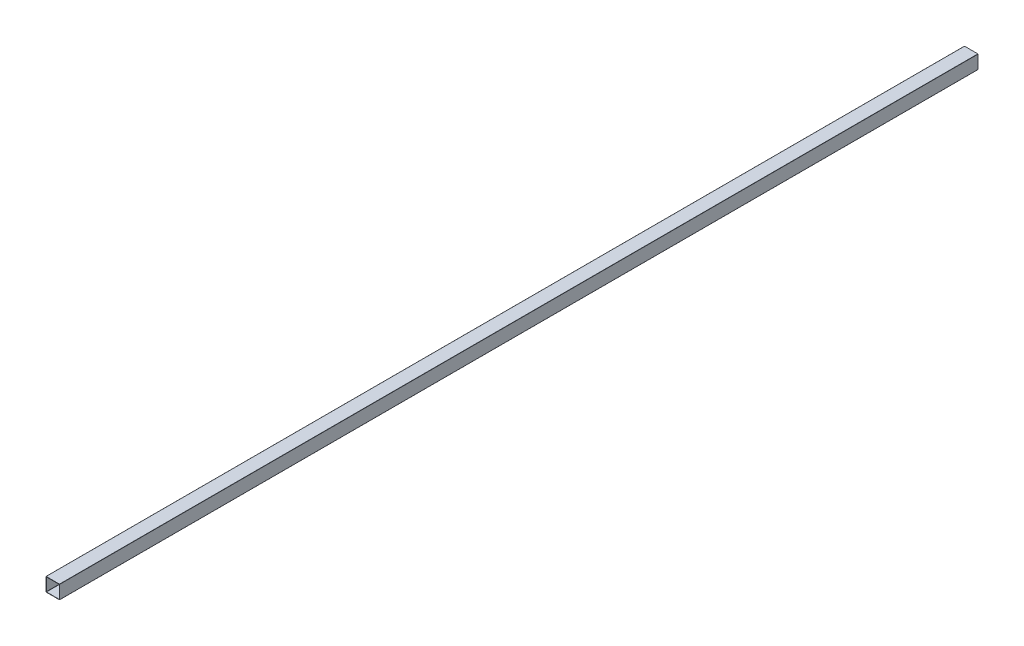
ISO-10303-21;
HEADER;
FILE_DESCRIPTION(('STEP AP214'),'2;1');
FILE_NAME('part.step','',(''),(''),'','','');
FILE_SCHEMA(('AUTOMOTIVE_DESIGN { 1 0 10303 214 1 1 1 1 }'));
ENDSEC;
DATA;
#1=APPLICATION_CONTEXT('core data for automotive mechanical design processes');
#2=APPLICATION_PROTOCOL_DEFINITION('international standard','automotive_design',2000,#1);
#3=PRODUCT_CONTEXT('',#1,'mechanical');
#4=PRODUCT('Part','Part','',(#3));
#5=PRODUCT_RELATED_PRODUCT_CATEGORY('part','',(#4));
#6=PRODUCT_DEFINITION_FORMATION('','',#4);
#7=PRODUCT_DEFINITION_CONTEXT('part definition',#1,'design');
#8=PRODUCT_DEFINITION('design','',#6,#7);
#9=PRODUCT_DEFINITION_SHAPE('','',#8);
#10=(LENGTH_UNIT() NAMED_UNIT(*) SI_UNIT(.MILLI.,.METRE.));
#11=(NAMED_UNIT(*) PLANE_ANGLE_UNIT() SI_UNIT($,.RADIAN.));
#12=(NAMED_UNIT(*) SI_UNIT($,.STERADIAN.) SOLID_ANGLE_UNIT());
#13=UNCERTAINTY_MEASURE_WITH_UNIT(LENGTH_MEASURE(1.E-05),#10,'distance_accuracy_value','');
#14=(GEOMETRIC_REPRESENTATION_CONTEXT(3) GLOBAL_UNCERTAINTY_ASSIGNED_CONTEXT((#13)) GLOBAL_UNIT_ASSIGNED_CONTEXT((#10,
#11,#12)) REPRESENTATION_CONTEXT('',''));
#15=CARTESIAN_POINT('',(0.,0.,0.));
#16=DIRECTION('',(0.,0.,1.));
#17=DIRECTION('',(1.,0.,0.));
#18=AXIS2_PLACEMENT_3D('',#15,#16,#17);
#19=CARTESIAN_POINT('',(44.45,-44.45,-6000.));
#20=DIRECTION('',(1.,0.,0.));
#21=DIRECTION('',(0.,0.,-1.));
#22=AXIS2_PLACEMENT_3D('',#19,#20,#21);
#23=PLANE('',#22);
#24=DIRECTION('',(0.,1.,0.));
#25=VECTOR('',#24,1.);
#26=CARTESIAN_POINT('',(44.45,-44.45,0.));
#27=LINE('',#26,#25);
#28=CARTESIAN_POINT('',(44.45,-43.45,0.));
#29=VERTEX_POINT('',#28);
#30=CARTESIAN_POINT('',(44.45,43.45,0.));
#31=VERTEX_POINT('',#30);
#32=EDGE_CURVE('E197',#29,#31,#27,.T.);
#33=ORIENTED_EDGE('',*,*,#32,.F.);
#34=DIRECTION('',(0.,0.,1.));
#35=VECTOR('',#34,1.);
#36=CARTESIAN_POINT('',(44.45,-43.45,-6000.));
#37=LINE('',#36,#35);
#38=CARTESIAN_POINT('',(44.45,-43.45,-6000.));
#39=VERTEX_POINT('',#38);
#40=EDGE_CURVE('E158',#29,#39,#37,.F.);
#41=ORIENTED_EDGE('',*,*,#40,.T.);
#42=DIRECTION('',(0.,1.,0.));
#43=VECTOR('',#42,1.);
#44=CARTESIAN_POINT('',(44.45,-44.45,-6000.));
#45=LINE('',#44,#43);
#46=CARTESIAN_POINT('',(44.45,43.45,-6000.));
#47=VERTEX_POINT('',#46);
#48=EDGE_CURVE('E185',#39,#47,#45,.T.);
#49=ORIENTED_EDGE('',*,*,#48,.T.);
#50=DIRECTION('',(0.,0.,1.));
#51=VECTOR('',#50,1.);
#52=CARTESIAN_POINT('',(44.45,43.45,-6000.));
#53=LINE('',#52,#51);
#54=EDGE_CURVE('E251',#47,#31,#53,.T.);
#55=ORIENTED_EDGE('',*,*,#54,.T.);
#56=EDGE_LOOP('',(#33,#41,#49,#55));
#57=FACE_BOUND('',#56,.T.);
#58=ADVANCED_FACE('F33',(#57),#23,.T.);
#59=CARTESIAN_POINT('',(-44.45,-44.45,-6000.));
#60=DIRECTION('',(0.,-1.,0.));
#61=DIRECTION('',(0.,0.,-1.));
#62=AXIS2_PLACEMENT_3D('',#59,#60,#61);
#63=PLANE('',#62);
#64=DIRECTION('',(1.,0.,0.));
#65=VECTOR('',#64,1.);
#66=CARTESIAN_POINT('',(-44.45,-44.45,0.));
#67=LINE('',#66,#65);
#68=CARTESIAN_POINT('',(-43.45,-44.45,0.));
#69=VERTEX_POINT('',#68);
#70=CARTESIAN_POINT('',(43.45,-44.45,0.));
#71=VERTEX_POINT('',#70);
#72=EDGE_CURVE('E189',#69,#71,#67,.T.);
#73=ORIENTED_EDGE('',*,*,#72,.F.);
#74=DIRECTION('',(0.,0.,1.));
#75=VECTOR('',#74,1.);
#76=CARTESIAN_POINT('',(-43.45,-44.45,-6000.));
#77=LINE('',#76,#75);
#78=CARTESIAN_POINT('',(-43.45,-44.45,-6000.));
#79=VERTEX_POINT('',#78);
#80=EDGE_CURVE('E238',#69,#79,#77,.F.);
#81=ORIENTED_EDGE('',*,*,#80,.T.);
#82=DIRECTION('',(1.,0.,0.));
#83=VECTOR('',#82,1.);
#84=CARTESIAN_POINT('',(-44.45,-44.45,-6000.));
#85=LINE('',#84,#83);
#86=CARTESIAN_POINT('',(43.45,-44.45,-6000.));
#87=VERTEX_POINT('',#86);
#88=EDGE_CURVE('E194',#79,#87,#85,.T.);
#89=ORIENTED_EDGE('',*,*,#88,.T.);
#90=DIRECTION('',(0.,0.,1.));
#91=VECTOR('',#90,1.);
#92=CARTESIAN_POINT('',(43.45,-44.45,-6000.));
#93=LINE('',#92,#91);
#94=EDGE_CURVE('E235',#87,#71,#93,.T.);
#95=ORIENTED_EDGE('',*,*,#94,.T.);
#96=EDGE_LOOP('',(#73,#81,#89,#95));
#97=FACE_BOUND('',#96,.T.);
#98=ADVANCED_FACE('F305',(#97),#63,.T.);
#99=CARTESIAN_POINT('',(-44.45,-44.45,-6000.));
#100=DIRECTION('',(-1.,0.,0.));
#101=DIRECTION('',(0.,0.,1.));
#102=AXIS2_PLACEMENT_3D('',#99,#100,#101);
#103=PLANE('',#102);
#104=DIRECTION('',(0.,-1.,0.));
#105=VECTOR('',#104,1.);
#106=CARTESIAN_POINT('',(-44.45,-44.45,-6000.));
#107=LINE('',#106,#105);
#108=CARTESIAN_POINT('',(-44.45,43.45,-6000.));
#109=VERTEX_POINT('',#108);
#110=CARTESIAN_POINT('',(-44.45,-43.45,-6000.));
#111=VERTEX_POINT('',#110);
#112=EDGE_CURVE('E191',#109,#111,#107,.T.);
#113=ORIENTED_EDGE('',*,*,#112,.T.);
#114=DIRECTION('',(0.,0.,1.));
#115=VECTOR('',#114,1.);
#116=CARTESIAN_POINT('',(-44.45,-43.45,-6000.));
#117=LINE('',#116,#115);
#118=CARTESIAN_POINT('',(-44.45,-43.45,0.));
#119=VERTEX_POINT('',#118);
#120=EDGE_CURVE('E224',#111,#119,#117,.T.);
#121=ORIENTED_EDGE('',*,*,#120,.T.);
#122=DIRECTION('',(0.,-1.,0.));
#123=VECTOR('',#122,1.);
#124=CARTESIAN_POINT('',(-44.45,-44.45,0.));
#125=LINE('',#124,#123);
#126=CARTESIAN_POINT('',(-44.45,43.45,0.));
#127=VERTEX_POINT('',#126);
#128=EDGE_CURVE('E203',#127,#119,#125,.T.);
#129=ORIENTED_EDGE('',*,*,#128,.F.);
#130=DIRECTION('',(0.,0.,1.));
#131=VECTOR('',#130,1.);
#132=CARTESIAN_POINT('',(-44.45,43.45,-6000.));
#133=LINE('',#132,#131);
#134=EDGE_CURVE('E222',#127,#109,#133,.F.);
#135=ORIENTED_EDGE('',*,*,#134,.T.);
#136=EDGE_LOOP('',(#113,#121,#129,#135));
#137=FACE_BOUND('',#136,.T.);
#138=ADVANCED_FACE('F311',(#137),#103,.T.);
#139=CARTESIAN_POINT('',(-44.45,44.45,-6000.));
#140=DIRECTION('',(0.,1.,0.));
#141=DIRECTION('',(0.,0.,1.));
#142=AXIS2_PLACEMENT_3D('',#139,#140,#141);
#143=PLANE('',#142);
#144=DIRECTION('',(-1.,0.,0.));
#145=VECTOR('',#144,1.);
#146=CARTESIAN_POINT('',(-44.45,44.45,-6000.));
#147=LINE('',#146,#145);
#148=CARTESIAN_POINT('',(43.45,44.45,-6000.));
#149=VERTEX_POINT('',#148);
#150=CARTESIAN_POINT('',(-43.45,44.45,-6000.));
#151=VERTEX_POINT('',#150);
#152=EDGE_CURVE('E188',#149,#151,#147,.T.);
#153=ORIENTED_EDGE('',*,*,#152,.T.);
#154=DIRECTION('',(0.,0.,1.));
#155=VECTOR('',#154,1.);
#156=CARTESIAN_POINT('',(-43.45,44.45,-6000.));
#157=LINE('',#156,#155);
#158=CARTESIAN_POINT('',(-43.45,44.45,0.));
#159=VERTEX_POINT('',#158);
#160=EDGE_CURVE('E248',#151,#159,#157,.T.);
#161=ORIENTED_EDGE('',*,*,#160,.T.);
#162=DIRECTION('',(-1.,0.,0.));
#163=VECTOR('',#162,1.);
#164=CARTESIAN_POINT('',(-44.45,44.45,0.));
#165=LINE('',#164,#163);
#166=CARTESIAN_POINT('',(43.45,44.45,0.));
#167=VERTEX_POINT('',#166);
#168=EDGE_CURVE('E200',#167,#159,#165,.T.);
#169=ORIENTED_EDGE('',*,*,#168,.F.);
#170=DIRECTION('',(0.,0.,1.));
#171=VECTOR('',#170,1.);
#172=CARTESIAN_POINT('',(43.45,44.45,-6000.));
#173=LINE('',#172,#171);
#174=EDGE_CURVE('E55',#167,#149,#173,.F.);
#175=ORIENTED_EDGE('',*,*,#174,.T.);
#176=EDGE_LOOP('',(#153,#161,#169,#175));
#177=FACE_BOUND('',#176,.T.);
#178=ADVANCED_FACE('F316',(#177),#143,.T.);
#179=CARTESIAN_POINT('',(0.,0.,-6000.));
#180=DIRECTION('',(0.,0.,-1.));
#181=DIRECTION('',(-1.,0.,0.));
#182=AXIS2_PLACEMENT_3D('',#179,#180,#181);
#183=PLANE('',#182);
#184=DIRECTION('',(0.,-1.,0.));
#185=VECTOR('',#184,1.);
#186=CARTESIAN_POINT('',(-42.56,-42.56,-6000.));
#187=LINE('',#186,#185);
#188=CARTESIAN_POINT('',(-42.56,41.56,-6000.));
#189=VERTEX_POINT('',#188);
#190=CARTESIAN_POINT('',(-42.56,-41.56,-6000.));
#191=VERTEX_POINT('',#190);
#192=EDGE_CURVE('E167',#189,#191,#187,.T.);
#193=ORIENTED_EDGE('',*,*,#192,.T.);
#194=CARTESIAN_POINT('',(-41.56,-41.56,-6000.));
#195=DIRECTION('',(0.,0.,-1.));
#196=DIRECTION('',(-1.,0.,0.));
#197=AXIS2_PLACEMENT_3D('',#194,#195,#196);
#198=CIRCLE('',#197,1.);
#199=CARTESIAN_POINT('',(-41.56,-42.56,-6000.));
#200=VERTEX_POINT('',#199);
#201=EDGE_CURVE('E11',#191,#200,#198,.F.);
#202=ORIENTED_EDGE('',*,*,#201,.T.);
#203=DIRECTION('',(1.,0.,0.));
#204=VECTOR('',#203,1.);
#205=CARTESIAN_POINT('',(-42.56,-42.56,-6000.));
#206=LINE('',#205,#204);
#207=CARTESIAN_POINT('',(41.56,-42.56,-6000.));
#208=VERTEX_POINT('',#207);
#209=EDGE_CURVE('E175',#200,#208,#206,.T.);
#210=ORIENTED_EDGE('',*,*,#209,.T.);
#211=CARTESIAN_POINT('',(41.56,-41.56,-6000.));
#212=DIRECTION('',(0.,0.,-1.));
#213=DIRECTION('',(-1.,0.,0.));
#214=AXIS2_PLACEMENT_3D('',#211,#212,#213);
#215=CIRCLE('',#214,1.);
#216=CARTESIAN_POINT('',(42.56,-41.56,-6000.));
#217=VERTEX_POINT('',#216);
#218=EDGE_CURVE('E262',#208,#217,#215,.F.);
#219=ORIENTED_EDGE('',*,*,#218,.T.);
#220=DIRECTION('',(0.,1.,0.));
#221=VECTOR('',#220,1.);
#222=CARTESIAN_POINT('',(42.56,-42.56,-6000.));
#223=LINE('',#222,#221);
#224=CARTESIAN_POINT('',(42.56,41.56,-6000.));
#225=VERTEX_POINT('',#224);
#226=EDGE_CURVE('E179',#217,#225,#223,.T.);
#227=ORIENTED_EDGE('',*,*,#226,.T.);
#228=CARTESIAN_POINT('',(41.56,41.56,-6000.));
#229=DIRECTION('',(0.,0.,-1.));
#230=DIRECTION('',(-1.,0.,0.));
#231=AXIS2_PLACEMENT_3D('',#228,#229,#230);
#232=CIRCLE('',#231,1.);
#233=CARTESIAN_POINT('',(41.56,42.56,-6000.));
#234=VERTEX_POINT('',#233);
#235=EDGE_CURVE('E258',#225,#234,#232,.F.);
#236=ORIENTED_EDGE('',*,*,#235,.T.);
#237=DIRECTION('',(-1.,0.,0.));
#238=VECTOR('',#237,1.);
#239=CARTESIAN_POINT('',(-42.56,42.56,-6000.));
#240=LINE('',#239,#238);
#241=CARTESIAN_POINT('',(-41.56,42.56,-6000.));
#242=VERTEX_POINT('',#241);
#243=EDGE_CURVE('E277',#234,#242,#240,.T.);
#244=ORIENTED_EDGE('',*,*,#243,.T.);
#245=CARTESIAN_POINT('',(-41.56,41.56,-6000.));
#246=DIRECTION('',(0.,0.,-1.));
#247=DIRECTION('',(-1.,0.,0.));
#248=AXIS2_PLACEMENT_3D('',#245,#246,#247);
#249=CIRCLE('',#248,1.);
#250=EDGE_CURVE('E157',#242,#189,#249,.F.);
#251=ORIENTED_EDGE('',*,*,#250,.T.);
#252=EDGE_LOOP('',(#193,#202,#210,#219,#227,#236,#244,#251));
#253=FACE_BOUND('',#252,.T.);
#254=ORIENTED_EDGE('',*,*,#88,.F.);
#255=CARTESIAN_POINT('',(-43.45,-43.45,-6000.));
#256=DIRECTION('',(0.,0.,-1.));
#257=DIRECTION('',(-1.,0.,0.));
#258=AXIS2_PLACEMENT_3D('',#255,#256,#257);
#259=CIRCLE('',#258,1.);
#260=EDGE_CURVE('E245',#79,#111,#259,.T.);
#261=ORIENTED_EDGE('',*,*,#260,.T.);
#262=ORIENTED_EDGE('',*,*,#112,.F.);
#263=CARTESIAN_POINT('',(-43.45,43.45,-6000.));
#264=DIRECTION('',(0.,0.,-1.));
#265=DIRECTION('',(-1.,0.,0.));
#266=AXIS2_PLACEMENT_3D('',#263,#264,#265);
#267=CIRCLE('',#266,1.);
#268=EDGE_CURVE('E48',#109,#151,#267,.T.);
#269=ORIENTED_EDGE('',*,*,#268,.T.);
#270=ORIENTED_EDGE('',*,*,#152,.F.);
#271=CARTESIAN_POINT('',(43.45,43.45,-6000.));
#272=DIRECTION('',(0.,0.,-1.));
#273=DIRECTION('',(-1.,0.,0.));
#274=AXIS2_PLACEMENT_3D('',#271,#272,#273);
#275=CIRCLE('',#274,1.);
#276=EDGE_CURVE('E240',#149,#47,#275,.T.);
#277=ORIENTED_EDGE('',*,*,#276,.T.);
#278=ORIENTED_EDGE('',*,*,#48,.F.);
#279=CARTESIAN_POINT('',(43.45,-43.45,-6000.));
#280=DIRECTION('',(0.,0.,-1.));
#281=DIRECTION('',(-1.,0.,0.));
#282=AXIS2_PLACEMENT_3D('',#279,#280,#281);
#283=CIRCLE('',#282,1.);
#284=EDGE_CURVE('E242',#39,#87,#283,.T.);
#285=ORIENTED_EDGE('',*,*,#284,.T.);
#286=EDGE_LOOP('',(#254,#261,#262,#269,#270,#277,#278,#285));
#287=FACE_BOUND('',#286,.T.);
#288=ADVANCED_FACE('F267',(#253,#287),#183,.T.);
#289=CARTESIAN_POINT('',(0.,0.,0.));
#290=DIRECTION('',(0.,0.,-1.));
#291=DIRECTION('',(-1.,0.,0.));
#292=AXIS2_PLACEMENT_3D('',#289,#290,#291);
#293=PLANE('',#292);
#294=DIRECTION('',(0.,1.,0.));
#295=VECTOR('',#294,1.);
#296=CARTESIAN_POINT('',(42.56,-42.56,0.));
#297=LINE('',#296,#295);
#298=CARTESIAN_POINT('',(42.56,-41.56,0.));
#299=VERTEX_POINT('',#298);
#300=CARTESIAN_POINT('',(42.56,41.56,0.));
#301=VERTEX_POINT('',#300);
#302=EDGE_CURVE('E181',#299,#301,#297,.T.);
#303=ORIENTED_EDGE('',*,*,#302,.F.);
#304=CARTESIAN_POINT('',(41.56,-41.56,0.));
#305=DIRECTION('',(0.,0.,-1.));
#306=DIRECTION('',(-1.,0.,0.));
#307=AXIS2_PLACEMENT_3D('',#304,#305,#306);
#308=CIRCLE('',#307,1.);
#309=CARTESIAN_POINT('',(41.56,-42.56,0.));
#310=VERTEX_POINT('',#309);
#311=EDGE_CURVE('E260',#299,#310,#308,.T.);
#312=ORIENTED_EDGE('',*,*,#311,.T.);
#313=DIRECTION('',(1.,0.,0.));
#314=VECTOR('',#313,1.);
#315=CARTESIAN_POINT('',(-42.56,-42.56,0.));
#316=LINE('',#315,#314);
#317=CARTESIAN_POINT('',(-41.56,-42.56,0.));
#318=VERTEX_POINT('',#317);
#319=EDGE_CURVE('E281',#318,#310,#316,.T.);
#320=ORIENTED_EDGE('',*,*,#319,.F.);
#321=CARTESIAN_POINT('',(-41.56,-41.56,0.));
#322=DIRECTION('',(0.,0.,-1.));
#323=DIRECTION('',(-1.,0.,0.));
#324=AXIS2_PLACEMENT_3D('',#321,#322,#323);
#325=CIRCLE('',#324,1.);
#326=CARTESIAN_POINT('',(-42.56,-41.56,0.));
#327=VERTEX_POINT('',#326);
#328=EDGE_CURVE('E41',#318,#327,#325,.T.);
#329=ORIENTED_EDGE('',*,*,#328,.T.);
#330=DIRECTION('',(0.,-1.,0.));
#331=VECTOR('',#330,1.);
#332=CARTESIAN_POINT('',(-42.56,-42.56,0.));
#333=LINE('',#332,#331);
#334=CARTESIAN_POINT('',(-42.56,41.56,0.));
#335=VERTEX_POINT('',#334);
#336=EDGE_CURVE('E164',#335,#327,#333,.T.);
#337=ORIENTED_EDGE('',*,*,#336,.F.);
#338=CARTESIAN_POINT('',(-41.56,41.56,0.));
#339=DIRECTION('',(0.,0.,-1.));
#340=DIRECTION('',(-1.,0.,0.));
#341=AXIS2_PLACEMENT_3D('',#338,#339,#340);
#342=CIRCLE('',#341,1.);
#343=CARTESIAN_POINT('',(-41.56,42.56,0.));
#344=VERTEX_POINT('',#343);
#345=EDGE_CURVE('E147',#335,#344,#342,.T.);
#346=ORIENTED_EDGE('',*,*,#345,.T.);
#347=DIRECTION('',(-1.,0.,0.));
#348=VECTOR('',#347,1.);
#349=CARTESIAN_POINT('',(-42.56,42.56,0.));
#350=LINE('',#349,#348);
#351=CARTESIAN_POINT('',(41.56,42.56,0.));
#352=VERTEX_POINT('',#351);
#353=EDGE_CURVE('E176',#352,#344,#350,.T.);
#354=ORIENTED_EDGE('',*,*,#353,.F.);
#355=CARTESIAN_POINT('',(41.56,41.56,0.));
#356=DIRECTION('',(0.,0.,-1.));
#357=DIRECTION('',(-1.,0.,0.));
#358=AXIS2_PLACEMENT_3D('',#355,#356,#357);
#359=CIRCLE('',#358,1.);
#360=EDGE_CURVE('E256',#352,#301,#359,.T.);
#361=ORIENTED_EDGE('',*,*,#360,.T.);
#362=EDGE_LOOP('',(#303,#312,#320,#329,#337,#346,#354,#361));
#363=FACE_BOUND('',#362,.T.);
#364=ORIENTED_EDGE('',*,*,#128,.T.);
#365=CARTESIAN_POINT('',(-43.45,-43.45,0.));
#366=DIRECTION('',(0.,0.,-1.));
#367=DIRECTION('',(-1.,0.,0.));
#368=AXIS2_PLACEMENT_3D('',#365,#366,#367);
#369=CIRCLE('',#368,1.);
#370=EDGE_CURVE('E233',#119,#69,#369,.F.);
#371=ORIENTED_EDGE('',*,*,#370,.T.);
#372=ORIENTED_EDGE('',*,*,#72,.T.);
#373=CARTESIAN_POINT('',(43.45,-43.45,0.));
#374=DIRECTION('',(0.,0.,-1.));
#375=DIRECTION('',(-1.,0.,0.));
#376=AXIS2_PLACEMENT_3D('',#373,#374,#375);
#377=CIRCLE('',#376,1.);
#378=EDGE_CURVE('E229',#71,#29,#377,.F.);
#379=ORIENTED_EDGE('',*,*,#378,.T.);
#380=ORIENTED_EDGE('',*,*,#32,.T.);
#381=CARTESIAN_POINT('',(43.45,43.45,0.));
#382=DIRECTION('',(0.,0.,-1.));
#383=DIRECTION('',(-1.,0.,0.));
#384=AXIS2_PLACEMENT_3D('',#381,#382,#383);
#385=CIRCLE('',#384,1.);
#386=EDGE_CURVE('E227',#31,#167,#385,.F.);
#387=ORIENTED_EDGE('',*,*,#386,.T.);
#388=ORIENTED_EDGE('',*,*,#168,.T.);
#389=CARTESIAN_POINT('',(-43.45,43.45,0.));
#390=DIRECTION('',(0.,0.,-1.));
#391=DIRECTION('',(-1.,0.,0.));
#392=AXIS2_PLACEMENT_3D('',#389,#390,#391);
#393=CIRCLE('',#392,1.);
#394=EDGE_CURVE('E231',#159,#127,#393,.F.);
#395=ORIENTED_EDGE('',*,*,#394,.T.);
#396=EDGE_LOOP('',(#364,#371,#372,#379,#380,#387,#388,#395));
#397=FACE_BOUND('',#396,.T.);
#398=ADVANCED_FACE('F172',(#363,#397),#293,.F.);
#399=CARTESIAN_POINT('',(-42.56,-42.56,-6000.));
#400=DIRECTION('',(0.,-1.,0.));
#401=DIRECTION('',(0.,0.,-1.));
#402=AXIS2_PLACEMENT_3D('',#399,#400,#401);
#403=PLANE('',#402);
#404=ORIENTED_EDGE('',*,*,#319,.T.);
#405=DIRECTION('',(0.,0.,1.));
#406=VECTOR('',#405,1.);
#407=CARTESIAN_POINT('',(41.56,-42.56,-6000.));
#408=LINE('',#407,#406);
#409=EDGE_CURVE('E220',#310,#208,#408,.F.);
#410=ORIENTED_EDGE('',*,*,#409,.T.);
#411=ORIENTED_EDGE('',*,*,#209,.F.);
#412=DIRECTION('',(0.,0.,1.));
#413=VECTOR('',#412,1.);
#414=CARTESIAN_POINT('',(-41.56,-42.56,0.));
#415=LINE('',#414,#413);
#416=EDGE_CURVE('E217',#200,#318,#415,.T.);
#417=ORIENTED_EDGE('',*,*,#416,.T.);
#418=EDGE_LOOP('',(#404,#410,#411,#417));
#419=FACE_BOUND('',#418,.T.);
#420=ADVANCED_FACE('F283',(#419),#403,.F.);
#421=CARTESIAN_POINT('',(-42.56,-42.56,-6000.));
#422=DIRECTION('',(-1.,0.,0.));
#423=DIRECTION('',(0.,0.,1.));
#424=AXIS2_PLACEMENT_3D('',#421,#422,#423);
#425=PLANE('',#424);
#426=ORIENTED_EDGE('',*,*,#192,.F.);
#427=DIRECTION('',(0.,0.,1.));
#428=VECTOR('',#427,1.);
#429=CARTESIAN_POINT('',(-42.56,41.56,0.));
#430=LINE('',#429,#428);
#431=EDGE_CURVE('E151',#189,#335,#430,.T.);
#432=ORIENTED_EDGE('',*,*,#431,.T.);
#433=ORIENTED_EDGE('',*,*,#336,.T.);
#434=DIRECTION('',(0.,0.,1.));
#435=VECTOR('',#434,1.);
#436=CARTESIAN_POINT('',(-42.56,-41.56,-6000.));
#437=LINE('',#436,#435);
#438=EDGE_CURVE('E169',#327,#191,#437,.F.);
#439=ORIENTED_EDGE('',*,*,#438,.T.);
#440=EDGE_LOOP('',(#426,#432,#433,#439));
#441=FACE_BOUND('',#440,.T.);
#442=ADVANCED_FACE('F163',(#441),#425,.F.);
#443=CARTESIAN_POINT('',(-42.56,42.56,-6000.));
#444=DIRECTION('',(0.,1.,0.));
#445=DIRECTION('',(0.,0.,1.));
#446=AXIS2_PLACEMENT_3D('',#443,#444,#445);
#447=PLANE('',#446);
#448=ORIENTED_EDGE('',*,*,#353,.T.);
#449=DIRECTION('',(0.,0.,1.));
#450=VECTOR('',#449,1.);
#451=CARTESIAN_POINT('',(-41.56,42.56,-6000.));
#452=LINE('',#451,#450);
#453=EDGE_CURVE('E152',#344,#242,#452,.F.);
#454=ORIENTED_EDGE('',*,*,#453,.T.);
#455=ORIENTED_EDGE('',*,*,#243,.F.);
#456=DIRECTION('',(0.,0.,1.));
#457=VECTOR('',#456,1.);
#458=CARTESIAN_POINT('',(41.56,42.56,0.));
#459=LINE('',#458,#457);
#460=EDGE_CURVE('E168',#234,#352,#459,.T.);
#461=ORIENTED_EDGE('',*,*,#460,.T.);
#462=EDGE_LOOP('',(#448,#454,#455,#461));
#463=FACE_BOUND('',#462,.T.);
#464=ADVANCED_FACE('F292',(#463),#447,.F.);
#465=CARTESIAN_POINT('',(42.56,-42.56,-6000.));
#466=DIRECTION('',(1.,0.,0.));
#467=DIRECTION('',(0.,0.,-1.));
#468=AXIS2_PLACEMENT_3D('',#465,#466,#467);
#469=PLANE('',#468);
#470=ORIENTED_EDGE('',*,*,#302,.T.);
#471=DIRECTION('',(0.,0.,1.));
#472=VECTOR('',#471,1.);
#473=CARTESIAN_POINT('',(42.56,41.56,-6000.));
#474=LINE('',#473,#472);
#475=EDGE_CURVE('E215',#301,#225,#474,.F.);
#476=ORIENTED_EDGE('',*,*,#475,.T.);
#477=ORIENTED_EDGE('',*,*,#226,.F.);
#478=DIRECTION('',(0.,0.,1.));
#479=VECTOR('',#478,1.);
#480=CARTESIAN_POINT('',(42.56,-41.56,0.));
#481=LINE('',#480,#479);
#482=EDGE_CURVE('E212',#217,#299,#481,.T.);
#483=ORIENTED_EDGE('',*,*,#482,.T.);
#484=EDGE_LOOP('',(#470,#476,#477,#483));
#485=FACE_BOUND('',#484,.T.);
#486=ADVANCED_FACE('F275',(#485),#469,.F.);
#487=CARTESIAN_POINT('',(-41.56,41.56,-6000.));
#488=DIRECTION('',(0.,0.,-1.));
#489=DIRECTION('',(-1.,0.,0.));
#490=AXIS2_PLACEMENT_3D('',#487,#488,#489);
#491=CYLINDRICAL_SURFACE('',#490,1.);
#492=ORIENTED_EDGE('',*,*,#250,.F.);
#493=ORIENTED_EDGE('',*,*,#453,.F.);
#494=ORIENTED_EDGE('',*,*,#345,.F.);
#495=ORIENTED_EDGE('',*,*,#431,.F.);
#496=EDGE_LOOP('',(#492,#493,#494,#495));
#497=FACE_BOUND('',#496,.T.);
#498=ADVANCED_FACE('F150',(#497),#491,.F.);
#499=CARTESIAN_POINT('',(41.56,41.56,-6000.));
#500=DIRECTION('',(0.,0.,-1.));
#501=DIRECTION('',(-1.,0.,0.));
#502=AXIS2_PLACEMENT_3D('',#499,#500,#501);
#503=CYLINDRICAL_SURFACE('',#502,1.);
#504=ORIENTED_EDGE('',*,*,#235,.F.);
#505=ORIENTED_EDGE('',*,*,#475,.F.);
#506=ORIENTED_EDGE('',*,*,#360,.F.);
#507=ORIENTED_EDGE('',*,*,#460,.F.);
#508=EDGE_LOOP('',(#504,#505,#506,#507));
#509=FACE_BOUND('',#508,.T.);
#510=ADVANCED_FACE('F294',(#509),#503,.F.);
#511=CARTESIAN_POINT('',(41.56,-41.56,-6000.));
#512=DIRECTION('',(0.,0.,-1.));
#513=DIRECTION('',(-1.,0.,0.));
#514=AXIS2_PLACEMENT_3D('',#511,#512,#513);
#515=CYLINDRICAL_SURFACE('',#514,1.);
#516=ORIENTED_EDGE('',*,*,#218,.F.);
#517=ORIENTED_EDGE('',*,*,#409,.F.);
#518=ORIENTED_EDGE('',*,*,#311,.F.);
#519=ORIENTED_EDGE('',*,*,#482,.F.);
#520=EDGE_LOOP('',(#516,#517,#518,#519));
#521=FACE_BOUND('',#520,.T.);
#522=ADVANCED_FACE('F279',(#521),#515,.F.);
#523=CARTESIAN_POINT('',(-43.45,-43.45,-6000.));
#524=DIRECTION('',(0.,0.,1.));
#525=DIRECTION('',(1.,0.,0.));
#526=AXIS2_PLACEMENT_3D('',#523,#524,#525);
#527=CYLINDRICAL_SURFACE('',#526,1.);
#528=ORIENTED_EDGE('',*,*,#260,.F.);
#529=ORIENTED_EDGE('',*,*,#80,.F.);
#530=ORIENTED_EDGE('',*,*,#370,.F.);
#531=ORIENTED_EDGE('',*,*,#120,.F.);
#532=EDGE_LOOP('',(#528,#529,#530,#531));
#533=FACE_BOUND('',#532,.T.);
#534=ADVANCED_FACE('F301',(#533),#527,.T.);
#535=CARTESIAN_POINT('',(-43.45,43.45,-6000.));
#536=DIRECTION('',(0.,0.,1.));
#537=DIRECTION('',(1.,0.,0.));
#538=AXIS2_PLACEMENT_3D('',#535,#536,#537);
#539=CYLINDRICAL_SURFACE('',#538,1.);
#540=ORIENTED_EDGE('',*,*,#268,.F.);
#541=ORIENTED_EDGE('',*,*,#134,.F.);
#542=ORIENTED_EDGE('',*,*,#394,.F.);
#543=ORIENTED_EDGE('',*,*,#160,.F.);
#544=EDGE_LOOP('',(#540,#541,#542,#543));
#545=FACE_BOUND('',#544,.T.);
#546=ADVANCED_FACE('F368',(#545),#539,.T.);
#547=CARTESIAN_POINT('',(-41.56,-41.56,-6000.));
#548=DIRECTION('',(0.,0.,-1.));
#549=DIRECTION('',(-1.,0.,0.));
#550=AXIS2_PLACEMENT_3D('',#547,#548,#549);
#551=CYLINDRICAL_SURFACE('',#550,1.);
#552=ORIENTED_EDGE('',*,*,#201,.F.);
#553=ORIENTED_EDGE('',*,*,#438,.F.);
#554=ORIENTED_EDGE('',*,*,#328,.F.);
#555=ORIENTED_EDGE('',*,*,#416,.F.);
#556=EDGE_LOOP('',(#552,#553,#554,#555));
#557=FACE_BOUND('',#556,.T.);
#558=ADVANCED_FACE('F378',(#557),#551,.F.);
#559=CARTESIAN_POINT('',(43.45,-43.45,-6000.));
#560=DIRECTION('',(0.,0.,1.));
#561=DIRECTION('',(1.,0.,0.));
#562=AXIS2_PLACEMENT_3D('',#559,#560,#561);
#563=CYLINDRICAL_SURFACE('',#562,1.);
#564=ORIENTED_EDGE('',*,*,#284,.F.);
#565=ORIENTED_EDGE('',*,*,#40,.F.);
#566=ORIENTED_EDGE('',*,*,#378,.F.);
#567=ORIENTED_EDGE('',*,*,#94,.F.);
#568=EDGE_LOOP('',(#564,#565,#566,#567));
#569=FACE_BOUND('',#568,.T.);
#570=ADVANCED_FACE('F388',(#569),#563,.T.);
#571=CARTESIAN_POINT('',(43.45,43.45,-6000.));
#572=DIRECTION('',(0.,0.,1.));
#573=DIRECTION('',(1.,0.,0.));
#574=AXIS2_PLACEMENT_3D('',#571,#572,#573);
#575=CYLINDRICAL_SURFACE('',#574,1.);
#576=ORIENTED_EDGE('',*,*,#276,.F.);
#577=ORIENTED_EDGE('',*,*,#174,.F.);
#578=ORIENTED_EDGE('',*,*,#386,.F.);
#579=ORIENTED_EDGE('',*,*,#54,.F.);
#580=EDGE_LOOP('',(#576,#577,#578,#579));
#581=FACE_BOUND('',#580,.T.);
#582=ADVANCED_FACE('F35',(#581),#575,.T.);
#583=CLOSED_SHELL('',(#58,#98,#138,#178,#288,#398,#420,#442,#464,#486,#498,#510,#522,#534,#546,
#558,#570,#582));
#584=MANIFOLD_SOLID_BREP('B2',#583);
#585=ADVANCED_BREP_SHAPE_REPRESENTATION('',(#18,#584),#14);
#586=SHAPE_DEFINITION_REPRESENTATION(#9,#585);
ENDSEC;
END-ISO-10303-21;
